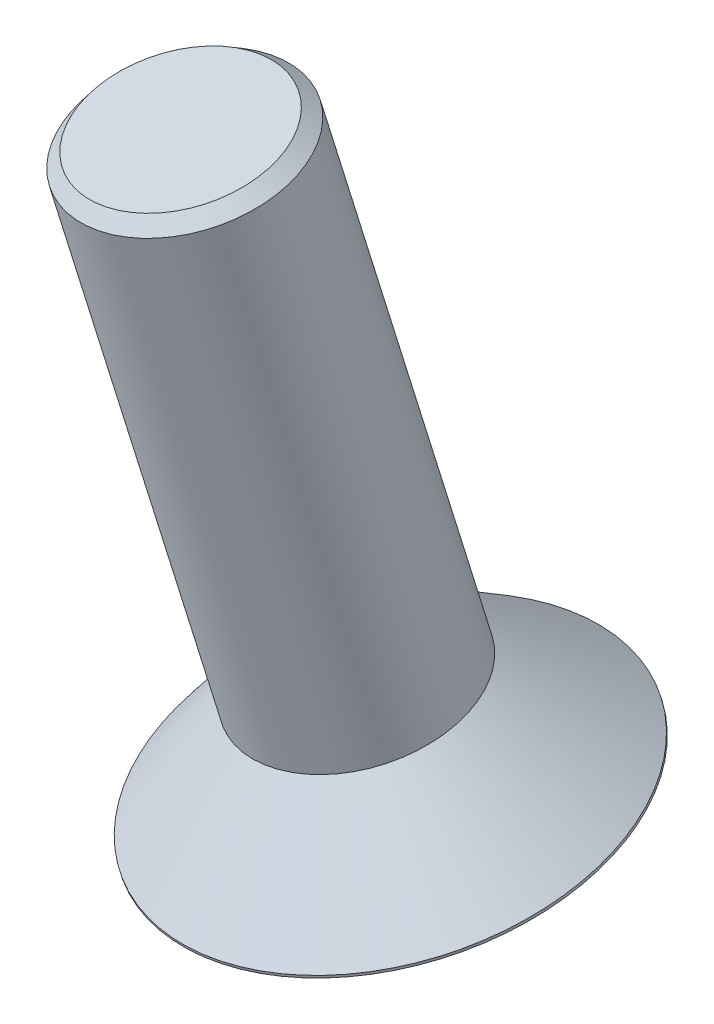
ISO-10303-21;
HEADER;
FILE_DESCRIPTION(('STEP AP214'),'2;1');
FILE_NAME('part.step','',(''),(''),'','','');
FILE_SCHEMA(('AUTOMOTIVE_DESIGN { 1 0 10303 214 1 1 1 1 }'));
ENDSEC;
DATA;
#1=APPLICATION_CONTEXT('core data for automotive mechanical design processes');
#2=APPLICATION_PROTOCOL_DEFINITION('international standard','automotive_design',2000,#1);
#3=PRODUCT_CONTEXT('',#1,'mechanical');
#4=PRODUCT('Part','Part','',(#3));
#5=PRODUCT_RELATED_PRODUCT_CATEGORY('part','',(#4));
#6=PRODUCT_DEFINITION_FORMATION('','',#4);
#7=PRODUCT_DEFINITION_CONTEXT('part definition',#1,'design');
#8=PRODUCT_DEFINITION('design','',#6,#7);
#9=PRODUCT_DEFINITION_SHAPE('','',#8);
#10=(LENGTH_UNIT() NAMED_UNIT(*) SI_UNIT(.MILLI.,.METRE.));
#11=(NAMED_UNIT(*) PLANE_ANGLE_UNIT() SI_UNIT($,.RADIAN.));
#12=(NAMED_UNIT(*) SI_UNIT($,.STERADIAN.) SOLID_ANGLE_UNIT());
#13=UNCERTAINTY_MEASURE_WITH_UNIT(LENGTH_MEASURE(1.E-05),#10,'distance_accuracy_value','');
#14=(GEOMETRIC_REPRESENTATION_CONTEXT(3) GLOBAL_UNCERTAINTY_ASSIGNED_CONTEXT((#13)) GLOBAL_UNIT_ASSIGNED_CONTEXT((#10,
#11,#12)) REPRESENTATION_CONTEXT('',''));
#15=CARTESIAN_POINT('',(0.,0.,0.));
#16=DIRECTION('',(0.,0.,1.));
#17=DIRECTION('',(1.,0.,0.));
#18=AXIS2_PLACEMENT_3D('',#15,#16,#17);
#19=CARTESIAN_POINT('',(1997.76747269297,587.683550072976,945.031482962225));
#20=DIRECTION('',(0.106047429691003,-0.967562635539971,-0.229295636597989));
#21=DIRECTION('',(0.,0.230595950426546,-0.973049591566061));
#22=AXIS2_PLACEMENT_3D('',#19,#20,#21);
#23=CYLINDRICAL_SURFACE('',#22,4.00000000245544);
#24=CARTESIAN_POINT('',(1997.74483231725,587.890117848009,945.080435957862));
#25=DIRECTION('',(-0.106047429690788,0.967562635540018,0.229295636597891));
#26=DIRECTION('',(0.,-0.230595950426442,0.973049591566086));
#27=AXIS2_PLACEMENT_3D('',#24,#25,#26);
#28=CIRCLE('',#27,4.00000000245544);
#29=CARTESIAN_POINT('',(1997.74483231725,586.967734045737,948.972634326516));
#30=VERTEX_POINT('',#29);
#31=EDGE_CURVE('E143',#30,#30,#28,.F.);
#32=ORIENTED_EDGE('',*,*,#31,.T.);
#33=EDGE_LOOP('',(#32));
#34=FACE_BOUND('',#33,.T.);
#35=CARTESIAN_POINT('',(1999.90819975606,568.151841240632,940.402805245604));
#36=DIRECTION('',(0.106047429691003,-0.967562635539971,-0.229295636597989));
#37=DIRECTION('',(0.,0.230595950426546,-0.973049591566061));
#38=AXIS2_PLACEMENT_3D('',#35,#36,#37);
#39=CIRCLE('',#38,4.00000000245546);
#40=CARTESIAN_POINT('',(1999.90819975606,569.074225042904,936.51060687695));
#41=VERTEX_POINT('',#40);
#42=EDGE_CURVE('E110',#41,#41,#39,.T.);
#43=ORIENTED_EDGE('',*,*,#42,.F.);
#44=EDGE_LOOP('',(#43));
#45=FACE_BOUND('',#44,.T.);
#46=ADVANCED_FACE('F31',(#34,#45),#23,.T.);
#47=CARTESIAN_POINT('',(2000.33238947455,564.281590701007,939.485622699812));
#48=DIRECTION('',(0.106047429691003,-0.967562635539971,-0.229295636597989));
#49=DIRECTION('',(0.,0.230595950426546,-0.973049591566061));
#50=AXIS2_PLACEMENT_3D('',#47,#48,#49);
#51=CONICAL_SURFACE('',#50,8.00000000000043,0.785398163418129);
#52=ORIENTED_EDGE('',*,*,#42,.T.);
#53=EDGE_LOOP('',(#52));
#54=FACE_BOUND('',#53,.T.);
#55=CARTESIAN_POINT('',(2000.33238947455,564.281590701007,939.485622699812));
#56=DIRECTION('',(0.106047429691003,-0.967562635539971,-0.229295636597989));
#57=DIRECTION('',(0.,0.230595950426546,-0.973049591566061));
#58=AXIS2_PLACEMENT_3D('',#55,#56,#57);
#59=CIRCLE('',#58,8.00000000000056);
#60=CARTESIAN_POINT('',(2000.33238947455,566.12635830442,931.701225967283));
#61=VERTEX_POINT('',#60);
#62=EDGE_CURVE('E128',#61,#61,#59,.T.);
#63=ORIENTED_EDGE('',*,*,#62,.F.);
#64=EDGE_LOOP('',(#63));
#65=FACE_BOUND('',#64,.T.);
#66=ADVANCED_FACE('F241',(#54,#65),#51,.T.);
#67=CARTESIAN_POINT('',(1997.76747269297,587.683550072976,945.031482962225));
#68=DIRECTION('',(0.106047429691003,-0.967562635539971,-0.229295636597989));
#69=DIRECTION('',(0.,0.230595950426546,-0.973049591566061));
#70=AXIS2_PLACEMENT_3D('',#67,#68,#69);
#71=CYLINDRICAL_SURFACE('',#70,8.00000000000043);
#72=ORIENTED_EDGE('',*,*,#62,.T.);
#73=EDGE_LOOP('',(#72));
#74=FACE_BOUND('',#73,.T.);
#75=CARTESIAN_POINT('',(2000.3429942176,564.184834436727,939.462693135981));
#76=DIRECTION('',(0.106047429691003,-0.967562635539971,-0.229295636597989));
#77=DIRECTION('',(0.,0.230595950426546,-0.973049591566061));
#78=AXIS2_PLACEMENT_3D('',#75,#76,#77);
#79=CIRCLE('',#78,8.00000000000049);
#80=CARTESIAN_POINT('',(2000.3429942176,566.02960204014,931.678296403452));
#81=VERTEX_POINT('',#80);
#82=EDGE_CURVE('E124',#81,#81,#79,.T.);
#83=ORIENTED_EDGE('',*,*,#82,.F.);
#84=EDGE_LOOP('',(#83));
#85=FACE_BOUND('',#84,.T.);
#86=ADVANCED_FACE('F246',(#74,#85),#71,.T.);
#87=CARTESIAN_POINT('',(2000.3429942176,564.184834436727,939.46269313598));
#88=DIRECTION('',(0.106047429691003,-0.967562635539971,-0.229295636597989));
#89=DIRECTION('',(0.,0.230595950426546,-0.973049591566061));
#90=AXIS2_PLACEMENT_3D('',#87,#88,#89);
#91=PLANE('',#90);
#92=DIRECTION('',(-0.144437833130114,-0.243139218826751,0.959177268615658));
#93=VECTOR('',#92,1.);
#94=CARTESIAN_POINT('',(2003.42796549745,565.409156434445,935.723176079897));
#95=LINE('',#94,#93);
#96=CARTESIAN_POINT('',(2003.01100938872,564.707273968019,938.492082348022));
#97=VERTEX_POINT('',#96);
#98=CARTESIAN_POINT('',(2002.59405327908,564.005391500068,941.260988622161));
#99=VERTEX_POINT('',#98);
#100=EDGE_CURVE('E130',#97,#99,#95,.T.);
#101=ORIENTED_EDGE('',*,*,#100,.F.);
#102=DIRECTION('',(0.779789734366311,-0.0621608564266816,0.622947829360709));
#103=VECTOR('',#102,1.);
#104=CARTESIAN_POINT('',(2003.01100938872,564.707273968,938.492082348017));
#105=LINE('',#104,#103);
#106=CARTESIAN_POINT('',(2000.75995032596,564.886716903776,936.693786865144));
#107=VERTEX_POINT('',#106);
#108=EDGE_CURVE('E123',#97,#107,#105,.F.);
#109=ORIENTED_EDGE('',*,*,#108,.T.);
#110=DIRECTION('',(0.924227567496754,0.180978362400209,-0.336229439255357));
#111=VECTOR('',#110,1.);
#112=CARTESIAN_POINT('',(1995.42391997859,563.841837841576,938.635008437235));
#113=LINE('',#112,#111);
#114=CARTESIAN_POINT('',(1998.09193515293,564.364277372804,937.664397650952));
#115=VERTEX_POINT('',#114);
#116=EDGE_CURVE('E105',#115,#107,#113,.T.);
#117=ORIENTED_EDGE('',*,*,#116,.F.);
#118=DIRECTION('',(0.144437833130263,0.243139218826755,-0.959177268615635));
#119=VECTOR('',#118,1.);
#120=CARTESIAN_POINT('',(1998.09193515293,564.364277372785,937.664397650948));
#121=LINE('',#120,#119);
#122=CARTESIAN_POINT('',(1997.67497904375,563.662394905628,940.433303922033));
#123=VERTEX_POINT('',#122);
#124=EDGE_CURVE('E113',#115,#123,#121,.F.);
#125=ORIENTED_EDGE('',*,*,#124,.T.);
#126=DIRECTION('',(-0.779789734366309,0.0621608564266758,-0.622947829360712));
#127=VECTOR('',#126,1.);
#128=CARTESIAN_POINT('',(2002.17709717056,563.30350903401,944.029894888831));
#129=LINE('',#128,#127);
#130=CARTESIAN_POINT('',(1999.92603810899,563.482951969673,942.231599406898));
#131=VERTEX_POINT('',#130);
#132=EDGE_CURVE('E125',#131,#123,#129,.T.);
#133=ORIENTED_EDGE('',*,*,#132,.F.);
#134=DIRECTION('',(-0.924227567496745,-0.180978362400201,0.336229439255386));
#135=VECTOR('',#134,1.);
#136=CARTESIAN_POINT('',(1999.92603810899,563.482951969654,942.231599406893));
#137=LINE('',#136,#135);
#138=EDGE_CURVE('E154',#131,#99,#137,.F.);
#139=ORIENTED_EDGE('',*,*,#138,.T.);
#140=EDGE_LOOP('',(#101,#109,#117,#125,#133,#139));
#141=FACE_BOUND('',#140,.T.);
#142=ORIENTED_EDGE('',*,*,#82,.T.);
#143=EDGE_LOOP('',(#142));
#144=FACE_BOUND('',#143,.T.);
#145=ADVANCED_FACE('F120',(#141,#144),#91,.T.);
#146=CARTESIAN_POINT('',(2001.66925276804,588.786657958331,945.292900482412));
#147=DIRECTION('',(-0.106047429691003,0.967562635539971,0.229295636597989));
#148=DIRECTION('',(0.,-0.230595950426546,0.973049591566061));
#149=AXIS2_PLACEMENT_3D('',#146,#147,#148);
#150=PLANE('',#149);
#151=CARTESIAN_POINT('',(1997.6918084753,588.373900325487,945.195084050992));
#152=DIRECTION('',(-0.106047429691003,0.967562635539971,0.229295636597989));
#153=DIRECTION('',(0.,-0.230595950426546,0.973049591566061));
#154=AXIS2_PLACEMENT_3D('',#151,#152,#153);
#155=CIRCLE('',#154,3.49999880383786);
#156=CARTESIAN_POINT('',(1997.6918084753,587.566814774825,948.600756457548));
#157=VERTEX_POINT('',#156);
#158=EDGE_CURVE('E146',#157,#157,#155,.T.);
#159=ORIENTED_EDGE('',*,*,#158,.T.);
#160=EDGE_LOOP('',(#159));
#161=FACE_BOUND('',#160,.T.);
#162=ADVANCED_FACE('F259',(#161),#150,.T.);
#163=CARTESIAN_POINT('',(2003.10982320831,568.311844341711,936.411062989844));
#164=DIRECTION('',(0.983814847934614,0.0685993190583324,0.165536939708713));
#165=DIRECTION('',(0.165927817189721,0.,-0.986137900844833));
#166=AXIS2_PLACEMENT_3D('',#163,#164,#165);
#167=PLANE('',#166);
#168=DIRECTION('',(-0.106047429691012,0.96756263553997,0.229295636597989));
#169=VECTOR('',#168,1.);
#170=CARTESIAN_POINT('',(2002.27591098993,566.908079407333,941.948875532108));
#171=LINE('',#170,#169);
#172=CARTESIAN_POINT('',(2002.38195841963,565.940516771793,941.71957989551));
#173=VERTEX_POINT('',#172);
#174=EDGE_CURVE('E151',#99,#173,#171,.T.);
#175=ORIENTED_EDGE('',*,*,#174,.T.);
#176=DIRECTION('',(-0.144437833130114,-0.243139218826751,0.959177268615658));
#177=VECTOR('',#176,1.);
#178=CARTESIAN_POINT('',(2002.79891452927,566.642399239744,938.950673621371));
#179=LINE('',#178,#177);
#180=CARTESIAN_POINT('',(2002.79891452927,566.642399239744,938.950673621371));
#181=VERTEX_POINT('',#180);
#182=EDGE_CURVE('E173',#173,#181,#179,.F.);
#183=ORIENTED_EDGE('',*,*,#182,.T.);
#184=DIRECTION('',(0.106047429691012,-0.96756263553997,-0.229295636597989));
#185=VECTOR('',#184,1.);
#186=CARTESIAN_POINT('',(2003.01100938872,564.707273968019,938.492082348022));
#187=LINE('',#186,#185);
#188=EDGE_CURVE('E117',#181,#97,#187,.T.);
#189=ORIENTED_EDGE('',*,*,#188,.T.);
#190=ORIENTED_EDGE('',*,*,#100,.T.);
#191=EDGE_LOOP('',(#175,#183,#189,#190));
#192=FACE_BOUND('',#191,.T.);
#193=ADVANCED_FACE('F186',(#192),#167,.F.);
#194=CARTESIAN_POINT('',(1995.10577768945,566.744525748842,939.322895347182));
#195=DIRECTION('',(-0.366820591209057,0.176265080631098,-0.913440351208085));
#196=DIRECTION('',(-0.927969819929477,0.,0.372655354583902));
#197=AXIS2_PLACEMENT_3D('',#194,#195,#196);
#198=PLANE('',#197);
#199=DIRECTION('',(-0.106047429691012,0.96756263553997,0.229295636597989));
#200=VECTOR('',#199,1.);
#201=CARTESIAN_POINT('',(2000.44180803682,567.789404811041,937.381673775091));
#202=LINE('',#201,#200);
#203=CARTESIAN_POINT('',(2000.54785546651,566.821842175501,937.152378138493));
#204=VERTEX_POINT('',#203);
#205=EDGE_CURVE('E140',#107,#204,#202,.T.);
#206=ORIENTED_EDGE('',*,*,#205,.T.);
#207=DIRECTION('',(0.924227567496754,0.180978362400209,-0.336229439255357));
#208=VECTOR('',#207,1.);
#209=CARTESIAN_POINT('',(1997.87984029348,566.299402644529,938.122988924301));
#210=LINE('',#209,#208);
#211=CARTESIAN_POINT('',(1997.87984029348,566.299402644529,938.122988924301));
#212=VERTEX_POINT('',#211);
#213=EDGE_CURVE('E108',#204,#212,#210,.F.);
#214=ORIENTED_EDGE('',*,*,#213,.T.);
#215=DIRECTION('',(0.106047429691012,-0.96756263553997,-0.229295636597989));
#216=VECTOR('',#215,1.);
#217=CARTESIAN_POINT('',(1998.09193515293,564.364277372804,937.664397650952));
#218=LINE('',#217,#216);
#219=EDGE_CURVE('E100',#212,#115,#218,.T.);
#220=ORIENTED_EDGE('',*,*,#219,.T.);
#221=ORIENTED_EDGE('',*,*,#116,.T.);
#222=EDGE_LOOP('',(#206,#214,#220,#221));
#223=FACE_BOUND('',#222,.T.);
#224=ADVANCED_FACE('F103',(#223),#198,.F.);
#225=CARTESIAN_POINT('',(2001.85895488142,566.206196941275,944.717781798778));
#226=DIRECTION('',(-0.616994256725985,-0.244864399689398,0.747903411499038));
#227=DIRECTION('',(0.771386471470371,0.,0.636366963027223));
#228=AXIS2_PLACEMENT_3D('',#225,#226,#227);
#229=PLANE('',#228);
#230=DIRECTION('',(-0.106047429691012,0.96756263553997,0.229295636597989));
#231=VECTOR('',#230,1.);
#232=CARTESIAN_POINT('',(1997.35683675461,566.565082812893,941.12119083198));
#233=LINE('',#232,#231);
#234=CARTESIAN_POINT('',(1997.4628841843,565.597520177353,940.891895195382));
#235=VERTEX_POINT('',#234);
#236=EDGE_CURVE('E109',#123,#235,#233,.T.);
#237=ORIENTED_EDGE('',*,*,#236,.T.);
#238=DIRECTION('',(-0.779789734366309,0.0621608564266758,-0.622947829360713));
#239=VECTOR('',#238,1.);
#240=CARTESIAN_POINT('',(1999.71394324954,565.418077241398,942.690190680246));
#241=LINE('',#240,#239);
#242=CARTESIAN_POINT('',(1999.71394324954,565.418077241398,942.690190680246));
#243=VERTEX_POINT('',#242);
#244=EDGE_CURVE('E11',#235,#243,#241,.F.);
#245=ORIENTED_EDGE('',*,*,#244,.T.);
#246=DIRECTION('',(0.106047429691012,-0.96756263553997,-0.229295636597989));
#247=VECTOR('',#246,1.);
#248=CARTESIAN_POINT('',(1999.92603810899,563.482951969654,942.231599406893));
#249=LINE('',#248,#247);
#250=EDGE_CURVE('E149',#243,#131,#249,.T.);
#251=ORIENTED_EDGE('',*,*,#250,.T.);
#252=ORIENTED_EDGE('',*,*,#132,.T.);
#253=EDGE_LOOP('',(#237,#245,#251,#252));
#254=FACE_BOUND('',#253,.T.);
#255=ADVANCED_FACE('F230',(#254),#229,.F.);
#256=CARTESIAN_POINT('',(2003.10982320831,568.311844341711,936.411062989844));
#257=DIRECTION('',(-0.106047429691016,0.967562635539969,0.229295636597994));
#258=DIRECTION('',(0.,-0.230595950426551,0.97304959156606));
#259=AXIS2_PLACEMENT_3D('',#256,#257,#258);
#260=PLANE('',#259);
#261=DIRECTION('',(0.924227567496754,0.180978362400209,-0.336229439255357));
#262=VECTOR('',#261,1.);
#263=CARTESIAN_POINT('',(2000.80862862803,567.61313973041,938.295114126299));
#264=LINE('',#263,#262);
#265=CARTESIAN_POINT('',(1998.67421648988,567.195188105688,939.071602754844));
#266=VERTEX_POINT('',#265);
#267=CARTESIAN_POINT('',(2000.27502559314,567.508651824161,938.489236283562));
#268=VERTEX_POINT('',#267);
#269=EDGE_CURVE('E164',#266,#268,#264,.T.);
#270=ORIENTED_EDGE('',*,*,#269,.T.);
#271=DIRECTION('',(-0.77978973436631,0.0621608564266752,-0.622947829360711));
#272=VECTOR('',#271,1.);
#273=CARTESIAN_POINT('',(2002.07587284285,567.365097475595,939.927872669468));
#274=LINE('',#273,#272);
#275=CARTESIAN_POINT('',(2001.6256610298,567.400986062786,939.568213572496));
#276=VERTEX_POINT('',#275);
#277=EDGE_CURVE('E166',#268,#276,#274,.F.);
#278=ORIENTED_EDGE('',*,*,#277,.T.);
#279=DIRECTION('',(-0.144437833130114,-0.243139218826751,0.959177268615658));
#280=VECTOR('',#279,1.);
#281=CARTESIAN_POINT('',(2001.292096142,566.839480088275,941.783338592399));
#282=LINE('',#281,#280);
#283=CARTESIAN_POINT('',(2001.37548736384,566.979856581715,941.229557338164));
#284=VERTEX_POINT('',#283);
#285=EDGE_CURVE('E162',#276,#284,#282,.T.);
#286=ORIENTED_EDGE('',*,*,#285,.T.);
#287=DIRECTION('',(0.924227567496744,0.180978362400214,-0.336229439255382));
#288=VECTOR('',#287,1.);
#289=CARTESIAN_POINT('',(1999.24107522864,566.561904957569,942.006045965637));
#290=LINE('',#289,#288);
#291=CARTESIAN_POINT('',(1999.77467826353,566.666392863818,941.811923808373));
#292=VERTEX_POINT('',#291);
#293=EDGE_CURVE('E158',#284,#292,#290,.F.);
#294=ORIENTED_EDGE('',*,*,#293,.T.);
#295=DIRECTION('',(-0.779789734366309,0.0621608564266758,-0.622947829360713));
#296=VECTOR('',#295,1.);
#297=CARTESIAN_POINT('',(1997.97383101133,566.809947212583,940.373287420481));
#298=LINE('',#297,#296);
#299=CARTESIAN_POINT('',(1998.42404282438,566.774058625392,940.732946517453));
#300=VERTEX_POINT('',#299);
#301=EDGE_CURVE('E156',#292,#300,#298,.T.);
#302=ORIENTED_EDGE('',*,*,#301,.T.);
#303=DIRECTION('',(-0.144437833130263,-0.243139218826762,0.959177268615633));
#304=VECTOR('',#303,1.);
#305=CARTESIAN_POINT('',(1998.75760771172,567.335564599128,938.517821500608));
#306=LINE('',#305,#304);
#307=EDGE_CURVE('E160',#300,#266,#306,.F.);
#308=ORIENTED_EDGE('',*,*,#307,.T.);
#309=EDGE_LOOP('',(#270,#278,#286,#294,#302,#308));
#310=FACE_BOUND('',#309,.T.);
#311=ADVANCED_FACE('F222',(#310),#260,.F.);
#312=CARTESIAN_POINT('',(1997.77379286379,567.266965280069,938.352284560899));
#313=DIRECTION('',(0.983814847934592,0.0685993190582956,0.165536939708858));
#314=DIRECTION('',(0.165927817189866,0.,-0.986137900844809));
#315=AXIS2_PLACEMENT_3D('',#312,#313,#314);
#316=PLANE('',#315);
#317=ORIENTED_EDGE('',*,*,#219,.F.);
#318=DIRECTION('',(0.144437833130263,0.243139218826762,-0.959177268615633));
#319=VECTOR('',#318,1.);
#320=CARTESIAN_POINT('',(1997.4628841843,565.597520177353,940.891895195382));
#321=LINE('',#320,#319);
#322=EDGE_CURVE('E51',#212,#235,#321,.F.);
#323=ORIENTED_EDGE('',*,*,#322,.T.);
#324=ORIENTED_EDGE('',*,*,#236,.F.);
#325=ORIENTED_EDGE('',*,*,#124,.F.);
#326=EDGE_LOOP('',(#317,#323,#324,#325));
#327=FACE_BOUND('',#326,.T.);
#328=ADVANCED_FACE('F114',(#327),#316,.T.);
#329=CARTESIAN_POINT('',(2002.69286709957,567.609961875284,939.179969257969));
#330=DIRECTION('',(-0.616994256725983,-0.244864399689398,0.74790341149904));
#331=DIRECTION('',(0.771386471470373,0.,0.636366963027221));
#332=AXIS2_PLACEMENT_3D('',#329,#330,#331);
#333=PLANE('',#332);
#334=ORIENTED_EDGE('',*,*,#188,.F.);
#335=DIRECTION('',(0.779789734366311,-0.0621608564266752,0.622947829360711));
#336=VECTOR('',#335,1.);
#337=CARTESIAN_POINT('',(2000.54785546651,566.821842175501,937.152378138493));
#338=LINE('',#337,#336);
#339=EDGE_CURVE('E169',#181,#204,#338,.F.);
#340=ORIENTED_EDGE('',*,*,#339,.T.);
#341=ORIENTED_EDGE('',*,*,#205,.F.);
#342=ORIENTED_EDGE('',*,*,#108,.F.);
#343=EDGE_LOOP('',(#334,#340,#341,#342));
#344=FACE_BOUND('',#343,.T.);
#345=ADVANCED_FACE('F229',(#344),#333,.T.);
#346=CARTESIAN_POINT('',(1997.74483231725,587.890117848009,945.080435957862));
#347=DIRECTION('',(0.106047429690788,-0.967562635540018,-0.229295636597891));
#348=DIRECTION('',(0.,0.230595950426442,-0.973049591566086));
#349=AXIS2_PLACEMENT_3D('',#346,#347,#348);
#350=CONICAL_SURFACE('',#349,4.00000000245544,0.785398163427376);
#351=ORIENTED_EDGE('',*,*,#158,.F.);
#352=EDGE_LOOP('',(#351));
#353=FACE_BOUND('',#352,.T.);
#354=ORIENTED_EDGE('',*,*,#31,.F.);
#355=EDGE_LOOP('',(#354));
#356=FACE_BOUND('',#355,.T.);
#357=ADVANCED_FACE('F302',(#353,#356),#350,.T.);
#358=CARTESIAN_POINT('',(1999.60789581985,566.385639876938,942.919486316845));
#359=DIRECTION('',(-0.366820591209083,0.176265080631093,-0.913440351208076));
#360=DIRECTION('',(-0.927969819929467,0.,0.372655354583928));
#361=AXIS2_PLACEMENT_3D('',#358,#359,#360);
#362=PLANE('',#361);
#363=ORIENTED_EDGE('',*,*,#250,.F.);
#364=DIRECTION('',(-0.924227567496744,-0.180978362400214,0.336229439255382));
#365=VECTOR('',#364,1.);
#366=CARTESIAN_POINT('',(2002.38195841963,565.940516771793,941.71957989551));
#367=LINE('',#366,#365);
#368=EDGE_CURVE('E38',#243,#173,#367,.F.);
#369=ORIENTED_EDGE('',*,*,#368,.T.);
#370=ORIENTED_EDGE('',*,*,#174,.F.);
#371=ORIENTED_EDGE('',*,*,#138,.F.);
#372=EDGE_LOOP('',(#363,#369,#370,#371));
#373=FACE_BOUND('',#372,.T.);
#374=ADVANCED_FACE('F178',(#373),#362,.T.);
#375=CARTESIAN_POINT('',(1999.20540797185,565.752663109208,941.043139524879));
#376=DIRECTION('',(0.779789734366309,-0.0621608564266758,0.622947829360713));
#377=DIRECTION('',(0.624154854931429,0.,-0.781300657279595));
#378=AXIS2_PLACEMENT_3D('',#375,#376,#377);
#379=CYLINDRICAL_SURFACE('',#378,1.00000000000001);
#380=CARTESIAN_POINT('',(1999.88072569322,565.698830228278,941.582628171775));
#381=DIRECTION('',(-0.983814847934577,-0.0685993190582737,-0.165536939708956));
#382=DIRECTION('',(-0.144437833130363,-0.243139218826769,0.959177268615616));
#383=AXIS2_PLACEMENT_3D('',#380,#381,#382);
#384=ELLIPSE('',#383,1.15470053837945,1.00000000000001);
#385=EDGE_CURVE('E209',#243,#292,#384,.T.);
#386=ORIENTED_EDGE('',*,*,#385,.F.);
#387=ORIENTED_EDGE('',*,*,#244,.F.);
#388=CARTESIAN_POINT('',(1998.53009025407,565.806495989852,940.503650880855));
#389=DIRECTION('',(-0.366820591208731,0.176265080631165,-0.913440351208203));
#390=DIRECTION('',(0.924227567496884,0.180978362400147,-0.336229439255034));
#391=AXIS2_PLACEMENT_3D('',#388,#389,#390);
#392=ELLIPSE('',#391,1.15470053837913,1.00000000000001);
#393=EDGE_CURVE('E211',#300,#235,#392,.F.);
#394=ORIENTED_EDGE('',*,*,#393,.F.);
#395=ORIENTED_EDGE('',*,*,#301,.F.);
#396=EDGE_LOOP('',(#386,#387,#394,#395));
#397=FACE_BOUND('',#396,.T.);
#398=ADVANCED_FACE('F220',(#397),#379,.F.);
#399=CARTESIAN_POINT('',(1999.28061125027,567.069884430217,935.519619595085));
#400=DIRECTION('',(0.144437833130263,0.243139218826762,-0.959177268615633));
#401=DIRECTION('',(0.,0.969341907287746,0.245715825244844));
#402=AXIS2_PLACEMENT_3D('',#399,#400,#401);
#403=CYLINDRICAL_SURFACE('',#402,1.00000000000001);
#404=ORIENTED_EDGE('',*,*,#393,.T.);
#405=ORIENTED_EDGE('',*,*,#322,.F.);
#406=CARTESIAN_POINT('',(1998.78026391957,566.227625470147,938.842307118246));
#407=DIRECTION('',(-0.616994256725619,-0.244864399689433,0.747903411499329));
#408=DIRECTION('',(-0.779789734366598,0.0621608564265609,-0.622947829360362));
#409=AXIS2_PLACEMENT_3D('',#406,#407,#408);
#410=ELLIPSE('',#409,1.15470053837921,1.00000000000001);
#411=EDGE_CURVE('E195',#266,#212,#410,.T.);
#412=ORIENTED_EDGE('',*,*,#411,.F.);
#413=ORIENTED_EDGE('',*,*,#307,.F.);
#414=EDGE_LOOP('',(#404,#405,#412,#413));
#415=FACE_BOUND('',#414,.T.);
#416=ADVANCED_FACE('F216',(#415),#403,.F.);
#417=CARTESIAN_POINT('',(2004.68315300281,566.639221383662,939.835528758001));
#418=DIRECTION('',(-0.924227567496744,-0.180978362400214,0.336229439255382));
#419=DIRECTION('',(0.341874791057337,0.,0.939745511954966));
#420=AXIS2_PLACEMENT_3D('',#417,#418,#419);
#421=CYLINDRICAL_SURFACE('',#420,1.00000000000001);
#422=ORIENTED_EDGE('',*,*,#385,.T.);
#423=ORIENTED_EDGE('',*,*,#293,.F.);
#424=CARTESIAN_POINT('',(2001.48153479353,566.012293946175,941.000261701566));
#425=DIRECTION('',(0.616994256725549,0.244864399689439,-0.747903411499384));
#426=DIRECTION('',(-0.779789734366653,0.0621608564265391,-0.622947829360295));
#427=AXIS2_PLACEMENT_3D('',#424,#425,#426);
#428=ELLIPSE('',#427,1.15470053837925,1.00000000000001);
#429=EDGE_CURVE('E191',#173,#284,#428,.F.);
#430=ORIENTED_EDGE('',*,*,#429,.F.);
#431=ORIENTED_EDGE('',*,*,#368,.F.);
#432=EDGE_LOOP('',(#422,#423,#430,#431));
#433=FACE_BOUND('',#432,.T.);
#434=ADVANCED_FACE('F192',(#433),#421,.F.);
#435=CARTESIAN_POINT('',(2003.58269122921,567.16801662554,937.095207704454));
#436=DIRECTION('',(-0.924227567496754,-0.180978362400209,0.336229439255357));
#437=DIRECTION('',(0.341874791057312,0.,0.939745511954976));
#438=AXIS2_PLACEMENT_3D('',#435,#436,#437);
#439=CYLINDRICAL_SURFACE('',#438,1.00000000000001);
#440=ORIENTED_EDGE('',*,*,#411,.T.);
#441=ORIENTED_EDGE('',*,*,#213,.F.);
#442=CARTESIAN_POINT('',(2000.38107302283,566.541089188621,938.259940646964));
#443=DIRECTION('',(0.983814847934575,0.0685993190582706,0.165536939708968));
#444=DIRECTION('',(-0.144437833130375,-0.243139218826769,0.959177268615614));
#445=AXIS2_PLACEMENT_3D('',#442,#443,#444);
#446=ELLIPSE('',#445,1.15470053837944,1.00000000000001);
#447=EDGE_CURVE('E196',#268,#204,#446,.F.);
#448=ORIENTED_EDGE('',*,*,#447,.F.);
#449=ORIENTED_EDGE('',*,*,#269,.F.);
#450=EDGE_LOOP('',(#440,#441,#448,#449));
#451=FACE_BOUND('',#450,.T.);
#452=ADVANCED_FACE('F227',(#451),#439,.F.);
#453=CARTESIAN_POINT('',(2002.23205579007,567.275682387113,936.016230413538));
#454=DIRECTION('',(0.144437833130114,0.243139218826751,-0.959177268615658));
#455=DIRECTION('',(0.,0.96934190728775,0.245715825244828));
#456=AXIS2_PLACEMENT_3D('',#453,#454,#455);
#457=CYLINDRICAL_SURFACE('',#456,1.00000000000001);
#458=ORIENTED_EDGE('',*,*,#429,.T.);
#459=ORIENTED_EDGE('',*,*,#285,.F.);
#460=CARTESIAN_POINT('',(2001.73170845949,566.433423427246,939.338917935898));
#461=DIRECTION('',(0.366820591208802,-0.176265080631151,0.913440351208178));
#462=DIRECTION('',(0.924227567496856,0.18097836240016,-0.336229439255104));
#463=AXIS2_PLACEMENT_3D('',#460,#461,#462);
#464=ELLIPSE('',#463,1.15470053837908,1.00000000000001);
#465=EDGE_CURVE('E200',#181,#276,#464,.T.);
#466=ORIENTED_EDGE('',*,*,#465,.F.);
#467=ORIENTED_EDGE('',*,*,#182,.F.);
#468=EDGE_LOOP('',(#458,#459,#466,#467));
#469=FACE_BOUND('',#468,.T.);
#470=ADVANCED_FACE('F199',(#469),#457,.F.);
#471=CARTESIAN_POINT('',(2001.05639074116,566.487256307934,938.79942929143));
#472=DIRECTION('',(0.779789734366311,-0.0621608564266752,0.622947829360711));
#473=DIRECTION('',(0.624154854931427,0.,-0.781300657279596));
#474=AXIS2_PLACEMENT_3D('',#471,#472,#473);
#475=CYLINDRICAL_SURFACE('',#474,1.00000000000001);
#476=ORIENTED_EDGE('',*,*,#447,.T.);
#477=ORIENTED_EDGE('',*,*,#339,.F.);
#478=ORIENTED_EDGE('',*,*,#465,.T.);
#479=ORIENTED_EDGE('',*,*,#277,.F.);
#480=EDGE_LOOP('',(#476,#477,#478,#479));
#481=FACE_BOUND('',#480,.T.);
#482=ADVANCED_FACE('F225',(#481),#475,.F.);
#483=CLOSED_SHELL('',(#46,#66,#86,#145,#162,#193,#224,#255,#311,#328,#345,#357,#374,#398,#416,
#434,#452,#470,#482));
#484=MANIFOLD_SOLID_BREP('B2',#483);
#485=ADVANCED_BREP_SHAPE_REPRESENTATION('',(#18,#484),#14);
#486=SHAPE_DEFINITION_REPRESENTATION(#9,#485);
ENDSEC;
END-ISO-10303-21;
